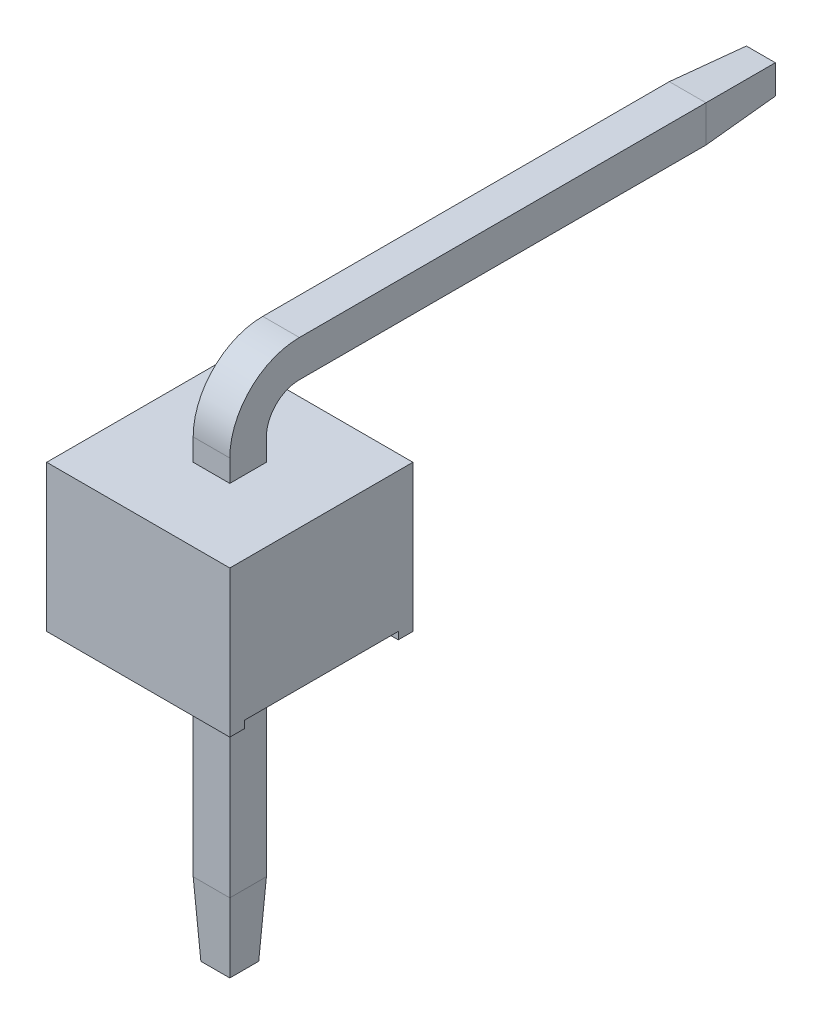
ISO-10303-21;
HEADER;
FILE_DESCRIPTION(('STEP AP214'),'2;1');
FILE_NAME('part.step','',(''),(''),'','','');
FILE_SCHEMA(('AUTOMOTIVE_DESIGN { 1 0 10303 214 1 1 1 1 }'));
ENDSEC;
DATA;
#1=APPLICATION_CONTEXT('core data for automotive mechanical design processes');
#2=APPLICATION_PROTOCOL_DEFINITION('international standard','automotive_design',2000,#1);
#3=PRODUCT_CONTEXT('',#1,'mechanical');
#4=PRODUCT('Part','Part','',(#3));
#5=PRODUCT_RELATED_PRODUCT_CATEGORY('part','',(#4));
#6=PRODUCT_DEFINITION_FORMATION('','',#4);
#7=PRODUCT_DEFINITION_CONTEXT('part definition',#1,'design');
#8=PRODUCT_DEFINITION('design','',#6,#7);
#9=PRODUCT_DEFINITION_SHAPE('','',#8);
#10=(LENGTH_UNIT() NAMED_UNIT(*) SI_UNIT(.MILLI.,.METRE.));
#11=(NAMED_UNIT(*) PLANE_ANGLE_UNIT() SI_UNIT($,.RADIAN.));
#12=(NAMED_UNIT(*) SI_UNIT($,.STERADIAN.) SOLID_ANGLE_UNIT());
#13=UNCERTAINTY_MEASURE_WITH_UNIT(LENGTH_MEASURE(1.E-05),#10,'distance_accuracy_value','');
#14=(GEOMETRIC_REPRESENTATION_CONTEXT(3) GLOBAL_UNCERTAINTY_ASSIGNED_CONTEXT((#13)) GLOBAL_UNIT_ASSIGNED_CONTEXT((#10,
#11,#12)) REPRESENTATION_CONTEXT('',''));
#15=CARTESIAN_POINT('',(0.,0.,0.));
#16=DIRECTION('',(0.,0.,1.));
#17=DIRECTION('',(1.,0.,0.));
#18=AXIS2_PLACEMENT_3D('',#15,#16,#17);
#19=CARTESIAN_POINT('',(0.,2.,0.));
#20=DIRECTION('',(0.,-1.,0.));
#21=DIRECTION('',(0.,0.,-1.));
#22=AXIS2_PLACEMENT_3D('',#19,#20,#21);
#23=PLANE('',#22);
#24=DIRECTION('',(0.,0.,-1.));
#25=VECTOR('',#24,1.);
#26=CARTESIAN_POINT('',(1.25,2.,1.25));
#27=LINE('',#26,#25);
#28=CARTESIAN_POINT('',(1.25,2.,1.25));
#29=VERTEX_POINT('',#28);
#30=CARTESIAN_POINT('',(1.25,2.,-1.25));
#31=VERTEX_POINT('',#30);
#32=EDGE_CURVE('E318',#29,#31,#27,.T.);
#33=ORIENTED_EDGE('',*,*,#32,.T.);
#34=DIRECTION('',(-1.,0.,0.));
#35=VECTOR('',#34,1.);
#36=CARTESIAN_POINT('',(-1.25,2.,-1.25));
#37=LINE('',#36,#35);
#38=CARTESIAN_POINT('',(-1.25,2.,-1.25));
#39=VERTEX_POINT('',#38);
#40=EDGE_CURVE('E321',#31,#39,#37,.T.);
#41=ORIENTED_EDGE('',*,*,#40,.T.);
#42=DIRECTION('',(0.,0.,1.));
#43=VECTOR('',#42,1.);
#44=CARTESIAN_POINT('',(-1.25,2.,1.25));
#45=LINE('',#44,#43);
#46=CARTESIAN_POINT('',(-1.25,2.,1.25));
#47=VERTEX_POINT('',#46);
#48=EDGE_CURVE('E324',#39,#47,#45,.T.);
#49=ORIENTED_EDGE('',*,*,#48,.T.);
#50=DIRECTION('',(1.,0.,0.));
#51=VECTOR('',#50,1.);
#52=CARTESIAN_POINT('',(-1.25,2.,1.25));
#53=LINE('',#52,#51);
#54=EDGE_CURVE('E326',#47,#29,#53,.T.);
#55=ORIENTED_EDGE('',*,*,#54,.T.);
#56=EDGE_LOOP('',(#33,#41,#49,#55));
#57=FACE_BOUND('',#56,.T.);
#58=DIRECTION('',(0.,0.,1.));
#59=VECTOR('',#58,1.);
#60=CARTESIAN_POINT('',(-0.25,2.,0.25));
#61=LINE('',#60,#59);
#62=CARTESIAN_POINT('',(-0.25,2.,-0.25));
#63=VERTEX_POINT('',#62);
#64=CARTESIAN_POINT('',(-0.25,2.,0.25));
#65=VERTEX_POINT('',#64);
#66=EDGE_CURVE('E204',#63,#65,#61,.T.);
#67=ORIENTED_EDGE('',*,*,#66,.F.);
#68=DIRECTION('',(-1.,0.,0.));
#69=VECTOR('',#68,1.);
#70=CARTESIAN_POINT('',(-0.25,2.,-0.25));
#71=LINE('',#70,#69);
#72=CARTESIAN_POINT('',(0.25,2.,-0.25));
#73=VERTEX_POINT('',#72);
#74=EDGE_CURVE('E704',#73,#63,#71,.T.);
#75=ORIENTED_EDGE('',*,*,#74,.F.);
#76=DIRECTION('',(0.,0.,-1.));
#77=VECTOR('',#76,1.);
#78=CARTESIAN_POINT('',(0.25,2.,-0.25));
#79=LINE('',#78,#77);
#80=CARTESIAN_POINT('',(0.25,2.,0.25));
#81=VERTEX_POINT('',#80);
#82=EDGE_CURVE('E713',#81,#73,#79,.T.);
#83=ORIENTED_EDGE('',*,*,#82,.F.);
#84=DIRECTION('',(1.,0.,0.));
#85=VECTOR('',#84,1.);
#86=CARTESIAN_POINT('',(0.25,2.,0.25));
#87=LINE('',#86,#85);
#88=EDGE_CURVE('E710',#65,#81,#87,.T.);
#89=ORIENTED_EDGE('',*,*,#88,.F.);
#90=EDGE_LOOP('',(#67,#75,#83,#89));
#91=FACE_BOUND('',#90,.T.);
#92=ADVANCED_FACE('F36',(#57,#91),#23,.F.);
#93=CARTESIAN_POINT('',(0.,0.1,0.));
#94=DIRECTION('',(0.,1.,0.));
#95=DIRECTION('',(0.,0.,1.));
#96=AXIS2_PLACEMENT_3D('',#93,#94,#95);
#97=PLANE('',#96);
#98=DIRECTION('',(0.,0.,1.));
#99=VECTOR('',#98,1.);
#100=CARTESIAN_POINT('',(1.25,0.1,-1.05));
#101=LINE('',#100,#99);
#102=CARTESIAN_POINT('',(1.25,0.1,-1.05));
#103=VERTEX_POINT('',#102);
#104=CARTESIAN_POINT('',(1.25,0.1,1.05));
#105=VERTEX_POINT('',#104);
#106=EDGE_CURVE('E293',#103,#105,#101,.T.);
#107=ORIENTED_EDGE('',*,*,#106,.T.);
#108=DIRECTION('',(-1.,0.,0.));
#109=VECTOR('',#108,1.);
#110=CARTESIAN_POINT('',(-1.25,0.1,1.05));
#111=LINE('',#110,#109);
#112=CARTESIAN_POINT('',(-1.25,0.1,1.05));
#113=VERTEX_POINT('',#112);
#114=EDGE_CURVE('E296',#105,#113,#111,.T.);
#115=ORIENTED_EDGE('',*,*,#114,.T.);
#116=DIRECTION('',(0.,0.,-1.));
#117=VECTOR('',#116,1.);
#118=CARTESIAN_POINT('',(-1.25,0.1,-1.05));
#119=LINE('',#118,#117);
#120=CARTESIAN_POINT('',(-1.25,0.1,-1.05));
#121=VERTEX_POINT('',#120);
#122=EDGE_CURVE('E300',#113,#121,#119,.T.);
#123=ORIENTED_EDGE('',*,*,#122,.T.);
#124=DIRECTION('',(1.,0.,0.));
#125=VECTOR('',#124,1.);
#126=CARTESIAN_POINT('',(-1.25,0.1,-1.05));
#127=LINE('',#126,#125);
#128=EDGE_CURVE('E302',#121,#103,#127,.T.);
#129=ORIENTED_EDGE('',*,*,#128,.T.);
#130=EDGE_LOOP('',(#107,#115,#123,#129));
#131=FACE_BOUND('',#130,.T.);
#132=DIRECTION('',(0.,0.,1.));
#133=VECTOR('',#132,1.);
#134=CARTESIAN_POINT('',(0.25,0.1,-0.25));
#135=LINE('',#134,#133);
#136=CARTESIAN_POINT('',(0.25,0.1,-0.25));
#137=VERTEX_POINT('',#136);
#138=CARTESIAN_POINT('',(0.25,0.1,0.25));
#139=VERTEX_POINT('',#138);
#140=EDGE_CURVE('E259',#137,#139,#135,.T.);
#141=ORIENTED_EDGE('',*,*,#140,.F.);
#142=DIRECTION('',(1.,0.,0.));
#143=VECTOR('',#142,1.);
#144=CARTESIAN_POINT('',(-0.25,0.1,-0.25));
#145=LINE('',#144,#143);
#146=CARTESIAN_POINT('',(-0.25,0.1,-0.25));
#147=VERTEX_POINT('',#146);
#148=EDGE_CURVE('E281',#147,#137,#145,.T.);
#149=ORIENTED_EDGE('',*,*,#148,.F.);
#150=DIRECTION('',(0.,0.,-1.));
#151=VECTOR('',#150,1.);
#152=CARTESIAN_POINT('',(-0.25,0.1,-0.25));
#153=LINE('',#152,#151);
#154=CARTESIAN_POINT('',(-0.25,0.1,0.25));
#155=VERTEX_POINT('',#154);
#156=EDGE_CURVE('E278',#155,#147,#153,.T.);
#157=ORIENTED_EDGE('',*,*,#156,.F.);
#158=DIRECTION('',(-1.,0.,0.));
#159=VECTOR('',#158,1.);
#160=CARTESIAN_POINT('',(-0.25,0.1,0.25));
#161=LINE('',#160,#159);
#162=EDGE_CURVE('E275',#139,#155,#161,.T.);
#163=ORIENTED_EDGE('',*,*,#162,.F.);
#164=EDGE_LOOP('',(#141,#149,#157,#163));
#165=FACE_BOUND('',#164,.T.);
#166=ADVANCED_FACE('F365',(#131,#165),#97,.F.);
#167=CARTESIAN_POINT('',(0.,0.,0.));
#168=DIRECTION('',(0.,-1.,0.));
#169=DIRECTION('',(0.,0.,-1.));
#170=AXIS2_PLACEMENT_3D('',#167,#168,#169);
#171=PLANE('',#170);
#172=DIRECTION('',(1.,0.,0.));
#173=VECTOR('',#172,1.);
#174=CARTESIAN_POINT('',(-1.25,0.,-1.05));
#175=LINE('',#174,#173);
#176=CARTESIAN_POINT('',(-1.25,0.,-1.05));
#177=VERTEX_POINT('',#176);
#178=CARTESIAN_POINT('',(1.25,0.,-1.05));
#179=VERTEX_POINT('',#178);
#180=EDGE_CURVE('E297',#177,#179,#175,.T.);
#181=ORIENTED_EDGE('',*,*,#180,.F.);
#182=DIRECTION('',(0.,0.,1.));
#183=VECTOR('',#182,1.);
#184=CARTESIAN_POINT('',(-1.25,0.,1.25));
#185=LINE('',#184,#183);
#186=CARTESIAN_POINT('',(-1.25,0.,-1.25));
#187=VERTEX_POINT('',#186);
#188=EDGE_CURVE('E335',#187,#177,#185,.T.);
#189=ORIENTED_EDGE('',*,*,#188,.F.);
#190=DIRECTION('',(-1.,0.,0.));
#191=VECTOR('',#190,1.);
#192=CARTESIAN_POINT('',(-1.25,0.,-1.25));
#193=LINE('',#192,#191);
#194=CARTESIAN_POINT('',(1.25,0.,-1.25));
#195=VERTEX_POINT('',#194);
#196=EDGE_CURVE('E332',#195,#187,#193,.T.);
#197=ORIENTED_EDGE('',*,*,#196,.F.);
#198=DIRECTION('',(0.,0.,-1.));
#199=VECTOR('',#198,1.);
#200=CARTESIAN_POINT('',(1.25,0.,1.25));
#201=LINE('',#200,#199);
#202=EDGE_CURVE('E311',#179,#195,#201,.T.);
#203=ORIENTED_EDGE('',*,*,#202,.F.);
#204=EDGE_LOOP('',(#181,#189,#197,#203));
#205=FACE_BOUND('',#204,.T.);
#206=ADVANCED_FACE('F355',(#205),#171,.T.);
#207=CARTESIAN_POINT('',(1.25,2.,1.25));
#208=DIRECTION('',(-1.,0.,0.));
#209=DIRECTION('',(0.,0.,1.));
#210=AXIS2_PLACEMENT_3D('',#207,#208,#209);
#211=PLANE('',#210);
#212=ORIENTED_EDGE('',*,*,#106,.F.);
#213=DIRECTION('',(0.,-1.,0.));
#214=VECTOR('',#213,1.);
#215=CARTESIAN_POINT('',(1.25,0.1,-1.05));
#216=LINE('',#215,#214);
#217=EDGE_CURVE('E308',#103,#179,#216,.T.);
#218=ORIENTED_EDGE('',*,*,#217,.T.);
#219=ORIENTED_EDGE('',*,*,#202,.T.);
#220=DIRECTION('',(0.,-1.,0.));
#221=VECTOR('',#220,1.);
#222=CARTESIAN_POINT('',(1.25,2.,-1.25));
#223=LINE('',#222,#221);
#224=EDGE_CURVE('E12',#31,#195,#223,.T.);
#225=ORIENTED_EDGE('',*,*,#224,.F.);
#226=ORIENTED_EDGE('',*,*,#32,.F.);
#227=DIRECTION('',(0.,-1.,0.));
#228=VECTOR('',#227,1.);
#229=CARTESIAN_POINT('',(1.25,2.,1.25));
#230=LINE('',#229,#228);
#231=CARTESIAN_POINT('',(1.25,0.,1.25));
#232=VERTEX_POINT('',#231);
#233=EDGE_CURVE('E328',#29,#232,#230,.T.);
#234=ORIENTED_EDGE('',*,*,#233,.T.);
#235=CARTESIAN_POINT('',(1.25,0.,1.05));
#236=VERTEX_POINT('',#235);
#237=EDGE_CURVE('E329',#232,#236,#201,.T.);
#238=ORIENTED_EDGE('',*,*,#237,.T.);
#239=DIRECTION('',(0.,-1.,0.));
#240=VECTOR('',#239,1.);
#241=CARTESIAN_POINT('',(1.25,0.1,1.05));
#242=LINE('',#241,#240);
#243=EDGE_CURVE('E305',#105,#236,#242,.T.);
#244=ORIENTED_EDGE('',*,*,#243,.F.);
#245=EDGE_LOOP('',(#212,#218,#219,#225,#226,#234,#238,#244));
#246=FACE_BOUND('',#245,.T.);
#247=ADVANCED_FACE('F38',(#246),#211,.F.);
#248=CARTESIAN_POINT('',(-1.25,2.,-1.25));
#249=DIRECTION('',(0.,0.,1.));
#250=DIRECTION('',(1.,0.,0.));
#251=AXIS2_PLACEMENT_3D('',#248,#249,#250);
#252=PLANE('',#251);
#253=ORIENTED_EDGE('',*,*,#196,.T.);
#254=DIRECTION('',(0.,-1.,0.));
#255=VECTOR('',#254,1.);
#256=CARTESIAN_POINT('',(-1.25,2.,-1.25));
#257=LINE('',#256,#255);
#258=EDGE_CURVE('E44',#39,#187,#257,.T.);
#259=ORIENTED_EDGE('',*,*,#258,.F.);
#260=ORIENTED_EDGE('',*,*,#40,.F.);
#261=ORIENTED_EDGE('',*,*,#224,.T.);
#262=EDGE_LOOP('',(#253,#259,#260,#261));
#263=FACE_BOUND('',#262,.T.);
#264=ADVANCED_FACE('F382',(#263),#252,.F.);
#265=CARTESIAN_POINT('',(-1.25,2.,1.25));
#266=DIRECTION('',(1.,0.,0.));
#267=DIRECTION('',(0.,0.,-1.));
#268=AXIS2_PLACEMENT_3D('',#265,#266,#267);
#269=PLANE('',#268);
#270=ORIENTED_EDGE('',*,*,#188,.T.);
#271=DIRECTION('',(0.,-1.,0.));
#272=VECTOR('',#271,1.);
#273=CARTESIAN_POINT('',(-1.25,0.1,-1.05));
#274=LINE('',#273,#272);
#275=EDGE_CURVE('E312',#121,#177,#274,.T.);
#276=ORIENTED_EDGE('',*,*,#275,.F.);
#277=ORIENTED_EDGE('',*,*,#122,.F.);
#278=DIRECTION('',(0.,-1.,0.));
#279=VECTOR('',#278,1.);
#280=CARTESIAN_POINT('',(-1.25,0.1,1.05));
#281=LINE('',#280,#279);
#282=CARTESIAN_POINT('',(-1.25,0.,1.05));
#283=VERTEX_POINT('',#282);
#284=EDGE_CURVE('E314',#113,#283,#281,.T.);
#285=ORIENTED_EDGE('',*,*,#284,.T.);
#286=CARTESIAN_POINT('',(-1.25,0.,1.25));
#287=VERTEX_POINT('',#286);
#288=EDGE_CURVE('E334',#283,#287,#185,.T.);
#289=ORIENTED_EDGE('',*,*,#288,.T.);
#290=DIRECTION('',(0.,-1.,0.));
#291=VECTOR('',#290,1.);
#292=CARTESIAN_POINT('',(-1.25,2.,1.25));
#293=LINE('',#292,#291);
#294=EDGE_CURVE('E341',#47,#287,#293,.T.);
#295=ORIENTED_EDGE('',*,*,#294,.F.);
#296=ORIENTED_EDGE('',*,*,#48,.F.);
#297=ORIENTED_EDGE('',*,*,#258,.T.);
#298=EDGE_LOOP('',(#270,#276,#277,#285,#289,#295,#296,#297));
#299=FACE_BOUND('',#298,.T.);
#300=ADVANCED_FACE('F348',(#299),#269,.F.);
#301=CARTESIAN_POINT('',(-1.25,2.,1.25));
#302=DIRECTION('',(0.,0.,-1.));
#303=DIRECTION('',(-1.,0.,0.));
#304=AXIS2_PLACEMENT_3D('',#301,#302,#303);
#305=PLANE('',#304);
#306=DIRECTION('',(1.,0.,0.));
#307=VECTOR('',#306,1.);
#308=CARTESIAN_POINT('',(-1.25,0.,1.25));
#309=LINE('',#308,#307);
#310=EDGE_CURVE('E322',#287,#232,#309,.T.);
#311=ORIENTED_EDGE('',*,*,#310,.T.);
#312=ORIENTED_EDGE('',*,*,#233,.F.);
#313=ORIENTED_EDGE('',*,*,#54,.F.);
#314=ORIENTED_EDGE('',*,*,#294,.T.);
#315=EDGE_LOOP('',(#311,#312,#313,#314));
#316=FACE_BOUND('',#315,.T.);
#317=ADVANCED_FACE('F377',(#316),#305,.F.);
#318=DIRECTION('',(-1.,0.,0.));
#319=VECTOR('',#318,1.);
#320=CARTESIAN_POINT('',(-1.25,0.,1.05));
#321=LINE('',#320,#319);
#322=EDGE_CURVE('E292',#236,#283,#321,.T.);
#323=ORIENTED_EDGE('',*,*,#322,.F.);
#324=ORIENTED_EDGE('',*,*,#237,.F.);
#325=ORIENTED_EDGE('',*,*,#310,.F.);
#326=ORIENTED_EDGE('',*,*,#288,.F.);
#327=EDGE_LOOP('',(#323,#324,#325,#326));
#328=FACE_BOUND('',#327,.T.);
#329=ADVANCED_FACE('F373',(#328),#171,.T.);
#330=CARTESIAN_POINT('',(-1.25,0.1,-1.05));
#331=DIRECTION('',(0.,0.,-1.));
#332=DIRECTION('',(-1.,0.,0.));
#333=AXIS2_PLACEMENT_3D('',#330,#331,#332);
#334=PLANE('',#333);
#335=ORIENTED_EDGE('',*,*,#180,.T.);
#336=ORIENTED_EDGE('',*,*,#217,.F.);
#337=ORIENTED_EDGE('',*,*,#128,.F.);
#338=ORIENTED_EDGE('',*,*,#275,.T.);
#339=EDGE_LOOP('',(#335,#336,#337,#338));
#340=FACE_BOUND('',#339,.T.);
#341=ADVANCED_FACE('F358',(#340),#334,.F.);
#342=CARTESIAN_POINT('',(-1.25,0.1,1.05));
#343=DIRECTION('',(0.,0.,1.));
#344=DIRECTION('',(1.,0.,0.));
#345=AXIS2_PLACEMENT_3D('',#342,#343,#344);
#346=PLANE('',#345);
#347=ORIENTED_EDGE('',*,*,#322,.T.);
#348=ORIENTED_EDGE('',*,*,#284,.F.);
#349=ORIENTED_EDGE('',*,*,#114,.F.);
#350=ORIENTED_EDGE('',*,*,#243,.T.);
#351=EDGE_LOOP('',(#347,#348,#349,#350));
#352=FACE_BOUND('',#351,.T.);
#353=ADVANCED_FACE('F397',(#352),#346,.F.);
#354=CARTESIAN_POINT('',(0.25,-3.9,-0.25));
#355=DIRECTION('',(-1.,0.,0.));
#356=DIRECTION('',(0.,0.,1.));
#357=AXIS2_PLACEMENT_3D('',#354,#355,#356);
#358=PLANE('',#357);
#359=DIRECTION('',(0.,1.,0.));
#360=VECTOR('',#359,1.);
#361=CARTESIAN_POINT('',(0.25,-3.9,0.25));
#362=LINE('',#361,#360);
#363=CARTESIAN_POINT('',(0.25,-2.9,0.25));
#364=VERTEX_POINT('',#363);
#365=EDGE_CURVE('E290',#364,#139,#362,.T.);
#366=ORIENTED_EDGE('',*,*,#365,.F.);
#367=DIRECTION('',(0.,0.,1.));
#368=VECTOR('',#367,1.);
#369=CARTESIAN_POINT('',(0.25,-2.9,-0.25));
#370=LINE('',#369,#368);
#371=CARTESIAN_POINT('',(0.25,-2.9,-0.25));
#372=VERTEX_POINT('',#371);
#373=EDGE_CURVE('E243',#372,#364,#370,.T.);
#374=ORIENTED_EDGE('',*,*,#373,.F.);
#375=DIRECTION('',(0.,1.,0.));
#376=VECTOR('',#375,1.);
#377=CARTESIAN_POINT('',(0.25,-3.9,-0.25));
#378=LINE('',#377,#376);
#379=EDGE_CURVE('E284',#372,#137,#378,.T.);
#380=ORIENTED_EDGE('',*,*,#379,.T.);
#381=ORIENTED_EDGE('',*,*,#140,.T.);
#382=EDGE_LOOP('',(#366,#374,#380,#381));
#383=FACE_BOUND('',#382,.T.);
#384=ADVANCED_FACE('F422',(#383),#358,.F.);
#385=CARTESIAN_POINT('',(-0.25,-3.9,0.25));
#386=DIRECTION('',(0.,0.,-1.));
#387=DIRECTION('',(-1.,0.,0.));
#388=AXIS2_PLACEMENT_3D('',#385,#386,#387);
#389=PLANE('',#388);
#390=DIRECTION('',(0.,1.,0.));
#391=VECTOR('',#390,1.);
#392=CARTESIAN_POINT('',(-0.25,-3.9,0.25));
#393=LINE('',#392,#391);
#394=CARTESIAN_POINT('',(-0.25,-2.9,0.25));
#395=VERTEX_POINT('',#394);
#396=EDGE_CURVE('E288',#395,#155,#393,.T.);
#397=ORIENTED_EDGE('',*,*,#396,.F.);
#398=DIRECTION('',(-1.,0.,0.));
#399=VECTOR('',#398,1.);
#400=CARTESIAN_POINT('',(0.25,-2.9,0.25));
#401=LINE('',#400,#399);
#402=EDGE_CURVE('E246',#364,#395,#401,.T.);
#403=ORIENTED_EDGE('',*,*,#402,.F.);
#404=ORIENTED_EDGE('',*,*,#365,.T.);
#405=ORIENTED_EDGE('',*,*,#162,.T.);
#406=EDGE_LOOP('',(#397,#403,#404,#405));
#407=FACE_BOUND('',#406,.T.);
#408=ADVANCED_FACE('F429',(#407),#389,.F.);
#409=CARTESIAN_POINT('',(-0.25,-3.9,-0.25));
#410=DIRECTION('',(1.,0.,0.));
#411=DIRECTION('',(0.,0.,-1.));
#412=AXIS2_PLACEMENT_3D('',#409,#410,#411);
#413=PLANE('',#412);
#414=DIRECTION('',(0.,1.,0.));
#415=VECTOR('',#414,1.);
#416=CARTESIAN_POINT('',(-0.25,-3.9,-0.25));
#417=LINE('',#416,#415);
#418=CARTESIAN_POINT('',(-0.25,-2.9,-0.25));
#419=VERTEX_POINT('',#418);
#420=EDGE_CURVE('E286',#419,#147,#417,.T.);
#421=ORIENTED_EDGE('',*,*,#420,.F.);
#422=DIRECTION('',(0.,0.,-1.));
#423=VECTOR('',#422,1.);
#424=CARTESIAN_POINT('',(-0.25,-2.9,0.25));
#425=LINE('',#424,#423);
#426=EDGE_CURVE('E249',#395,#419,#425,.T.);
#427=ORIENTED_EDGE('',*,*,#426,.F.);
#428=ORIENTED_EDGE('',*,*,#396,.T.);
#429=ORIENTED_EDGE('',*,*,#156,.T.);
#430=EDGE_LOOP('',(#421,#427,#428,#429));
#431=FACE_BOUND('',#430,.T.);
#432=ADVANCED_FACE('F437',(#431),#413,.F.);
#433=CARTESIAN_POINT('',(-0.25,-3.9,-0.25));
#434=DIRECTION('',(0.,0.,1.));
#435=DIRECTION('',(1.,0.,0.));
#436=AXIS2_PLACEMENT_3D('',#433,#434,#435);
#437=PLANE('',#436);
#438=ORIENTED_EDGE('',*,*,#379,.F.);
#439=DIRECTION('',(1.,0.,0.));
#440=VECTOR('',#439,1.);
#441=CARTESIAN_POINT('',(-0.25,-2.9,-0.25));
#442=LINE('',#441,#440);
#443=EDGE_CURVE('E240',#419,#372,#442,.T.);
#444=ORIENTED_EDGE('',*,*,#443,.F.);
#445=ORIENTED_EDGE('',*,*,#420,.T.);
#446=ORIENTED_EDGE('',*,*,#148,.T.);
#447=EDGE_LOOP('',(#438,#444,#445,#446));
#448=FACE_BOUND('',#447,.T.);
#449=ADVANCED_FACE('F445',(#448),#437,.F.);
#450=CARTESIAN_POINT('',(-0.25,-2.9,-0.25));
#451=DIRECTION('',(0.,0.0523359562429439,0.998629534754574));
#452=DIRECTION('',(0.,-0.998629534754574,0.0523359562429439));
#453=AXIS2_PLACEMENT_3D('',#450,#451,#452);
#454=PLANE('',#453);
#455=ORIENTED_EDGE('',*,*,#443,.T.);
#456=DIRECTION('',(0.052264427688714,0.997264688634237,-0.052264427688714));
#457=VECTOR('',#456,1.);
#458=CARTESIAN_POINT('',(0.25,-2.9,-0.25));
#459=LINE('',#458,#457);
#460=CARTESIAN_POINT('',(0.197592220716959,-3.9,-0.197592220716959));
#461=VERTEX_POINT('',#460);
#462=EDGE_CURVE('E257',#461,#372,#459,.T.);
#463=ORIENTED_EDGE('',*,*,#462,.F.);
#464=DIRECTION('',(1.,0.,0.));
#465=VECTOR('',#464,1.);
#466=CARTESIAN_POINT('',(-0.25,-3.9,-0.197592220716959));
#467=LINE('',#466,#465);
#468=CARTESIAN_POINT('',(-0.197592220716959,-3.9,-0.197592220716959));
#469=VERTEX_POINT('',#468);
#470=EDGE_CURVE('E251',#469,#461,#467,.T.);
#471=ORIENTED_EDGE('',*,*,#470,.F.);
#472=DIRECTION('',(-0.052264427688714,0.997264688634237,-0.052264427688714));
#473=VECTOR('',#472,1.);
#474=CARTESIAN_POINT('',(-0.25,-2.9,-0.25));
#475=LINE('',#474,#473);
#476=EDGE_CURVE('E252',#469,#419,#475,.T.);
#477=ORIENTED_EDGE('',*,*,#476,.T.);
#478=EDGE_LOOP('',(#455,#463,#471,#477));
#479=FACE_BOUND('',#478,.T.);
#480=ADVANCED_FACE('F453',(#479),#454,.F.);
#481=CARTESIAN_POINT('',(0.25,-2.9,-0.25));
#482=DIRECTION('',(-0.998629534754574,0.0523359562429439,0.));
#483=DIRECTION('',(-0.0523359562429439,-0.998629534754574,0.));
#484=AXIS2_PLACEMENT_3D('',#481,#482,#483);
#485=PLANE('',#484);
#486=ORIENTED_EDGE('',*,*,#373,.T.);
#487=DIRECTION('',(0.052264427688714,0.997264688634237,0.052264427688714));
#488=VECTOR('',#487,1.);
#489=CARTESIAN_POINT('',(0.25,-2.9,0.25));
#490=LINE('',#489,#488);
#491=CARTESIAN_POINT('',(0.197592220716959,-3.9,0.197592220716959));
#492=VERTEX_POINT('',#491);
#493=EDGE_CURVE('E260',#492,#364,#490,.T.);
#494=ORIENTED_EDGE('',*,*,#493,.F.);
#495=DIRECTION('',(0.,0.,1.));
#496=VECTOR('',#495,1.);
#497=CARTESIAN_POINT('',(0.197592220716959,-3.9,-0.25));
#498=LINE('',#497,#496);
#499=EDGE_CURVE('E265',#461,#492,#498,.T.);
#500=ORIENTED_EDGE('',*,*,#499,.F.);
#501=ORIENTED_EDGE('',*,*,#462,.T.);
#502=EDGE_LOOP('',(#486,#494,#500,#501));
#503=FACE_BOUND('',#502,.T.);
#504=ADVANCED_FACE('F461',(#503),#485,.F.);
#505=CARTESIAN_POINT('',(0.25,-2.9,0.25));
#506=DIRECTION('',(0.,0.0523359562429439,-0.998629534754574));
#507=DIRECTION('',(0.,0.998629534754574,0.0523359562429439));
#508=AXIS2_PLACEMENT_3D('',#505,#506,#507);
#509=PLANE('',#508);
#510=ORIENTED_EDGE('',*,*,#402,.T.);
#511=DIRECTION('',(-0.052264427688714,0.997264688634237,0.052264427688714));
#512=VECTOR('',#511,1.);
#513=CARTESIAN_POINT('',(-0.25,-2.9,0.25));
#514=LINE('',#513,#512);
#515=CARTESIAN_POINT('',(-0.197592220716959,-3.9,0.197592220716959));
#516=VERTEX_POINT('',#515);
#517=EDGE_CURVE('E255',#516,#395,#514,.T.);
#518=ORIENTED_EDGE('',*,*,#517,.F.);
#519=DIRECTION('',(-1.,0.,0.));
#520=VECTOR('',#519,1.);
#521=CARTESIAN_POINT('',(0.25,-3.9,0.197592220716959));
#522=LINE('',#521,#520);
#523=EDGE_CURVE('E268',#492,#516,#522,.T.);
#524=ORIENTED_EDGE('',*,*,#523,.F.);
#525=ORIENTED_EDGE('',*,*,#493,.T.);
#526=EDGE_LOOP('',(#510,#518,#524,#525));
#527=FACE_BOUND('',#526,.T.);
#528=ADVANCED_FACE('F469',(#527),#509,.F.);
#529=CARTESIAN_POINT('',(-0.25,-2.9,0.25));
#530=DIRECTION('',(0.998629534754574,0.0523359562429439,0.));
#531=DIRECTION('',(-0.0523359562429439,0.998629534754574,0.));
#532=AXIS2_PLACEMENT_3D('',#529,#530,#531);
#533=PLANE('',#532);
#534=ORIENTED_EDGE('',*,*,#426,.T.);
#535=ORIENTED_EDGE('',*,*,#476,.F.);
#536=DIRECTION('',(0.,0.,-1.));
#537=VECTOR('',#536,1.);
#538=CARTESIAN_POINT('',(-0.197592220716959,-3.9,0.25));
#539=LINE('',#538,#537);
#540=EDGE_CURVE('E256',#516,#469,#539,.T.);
#541=ORIENTED_EDGE('',*,*,#540,.F.);
#542=ORIENTED_EDGE('',*,*,#517,.T.);
#543=EDGE_LOOP('',(#534,#535,#541,#542));
#544=FACE_BOUND('',#543,.T.);
#545=ADVANCED_FACE('F477',(#544),#533,.F.);
#546=CARTESIAN_POINT('',(0.,-3.9,0.));
#547=DIRECTION('',(0.,1.,0.));
#548=DIRECTION('',(0.,0.,1.));
#549=AXIS2_PLACEMENT_3D('',#546,#547,#548);
#550=PLANE('',#549);
#551=ORIENTED_EDGE('',*,*,#540,.T.);
#552=ORIENTED_EDGE('',*,*,#470,.T.);
#553=ORIENTED_EDGE('',*,*,#499,.T.);
#554=ORIENTED_EDGE('',*,*,#523,.T.);
#555=EDGE_LOOP('',(#551,#552,#553,#554));
#556=FACE_BOUND('',#555,.T.);
#557=ADVANCED_FACE('F485',(#556),#550,.F.);
#558=CARTESIAN_POINT('',(0.25,3.25,-0.700000000000008));
#559=DIRECTION('',(0.,1.,0.));
#560=DIRECTION('',(0.,0.,1.));
#561=AXIS2_PLACEMENT_3D('',#558,#559,#560);
#562=PLANE('',#561);
#563=DIRECTION('',(1.,0.,0.));
#564=VECTOR('',#563,1.);
#565=CARTESIAN_POINT('',(-0.25,3.25000000000001,-6.25));
#566=LINE('',#565,#564);
#567=CARTESIAN_POINT('',(-0.25,3.25000000000001,-6.25));
#568=VERTEX_POINT('',#567);
#569=CARTESIAN_POINT('',(0.25,3.25,-6.25));
#570=VERTEX_POINT('',#569);
#571=EDGE_CURVE('E51',#568,#570,#566,.T.);
#572=ORIENTED_EDGE('',*,*,#571,.F.);
#573=DIRECTION('',(0.,0.,-1.));
#574=VECTOR('',#573,1.);
#575=CARTESIAN_POINT('',(-0.25,3.25,-0.700000000000008));
#576=LINE('',#575,#574);
#577=CARTESIAN_POINT('',(-0.25,3.25,-0.700000000000008));
#578=VERTEX_POINT('',#577);
#579=EDGE_CURVE('E222',#578,#568,#576,.T.);
#580=ORIENTED_EDGE('',*,*,#579,.F.);
#581=DIRECTION('',(1.,0.,0.));
#582=VECTOR('',#581,1.);
#583=CARTESIAN_POINT('',(0.25,3.25,-0.700000000000008));
#584=LINE('',#583,#582);
#585=CARTESIAN_POINT('',(0.25,3.25,-0.700000000000008));
#586=VERTEX_POINT('',#585);
#587=EDGE_CURVE('E730',#578,#586,#584,.T.);
#588=ORIENTED_EDGE('',*,*,#587,.T.);
#589=DIRECTION('',(0.,0.,-1.));
#590=VECTOR('',#589,1.);
#591=CARTESIAN_POINT('',(0.25,3.25,-0.700000000000008));
#592=LINE('',#591,#590);
#593=EDGE_CURVE('E231',#586,#570,#592,.T.);
#594=ORIENTED_EDGE('',*,*,#593,.T.);
#595=EDGE_LOOP('',(#572,#580,#588,#594));
#596=FACE_BOUND('',#595,.T.);
#597=ADVANCED_FACE('F493',(#596),#562,.T.);
#598=CARTESIAN_POINT('',(-0.25,2.75,-0.700000000000001));
#599=DIRECTION('',(0.,-1.,0.));
#600=DIRECTION('',(0.,0.,-1.));
#601=AXIS2_PLACEMENT_3D('',#598,#599,#600);
#602=PLANE('',#601);
#603=DIRECTION('',(-1.,0.,0.));
#604=VECTOR('',#603,1.);
#605=CARTESIAN_POINT('',(0.25,2.75000000000001,-6.25));
#606=LINE('',#605,#604);
#607=CARTESIAN_POINT('',(0.25,2.75,-6.25));
#608=VERTEX_POINT('',#607);
#609=CARTESIAN_POINT('',(-0.25,2.75000000000001,-6.25));
#610=VERTEX_POINT('',#609);
#611=EDGE_CURVE('E208',#608,#610,#606,.T.);
#612=ORIENTED_EDGE('',*,*,#611,.F.);
#613=DIRECTION('',(0.,0.,-1.));
#614=VECTOR('',#613,1.);
#615=CARTESIAN_POINT('',(0.25,2.75,-0.700000000000001));
#616=LINE('',#615,#614);
#617=CARTESIAN_POINT('',(0.25,2.75,-0.700000000000001));
#618=VERTEX_POINT('',#617);
#619=EDGE_CURVE('E228',#618,#608,#616,.T.);
#620=ORIENTED_EDGE('',*,*,#619,.F.);
#621=DIRECTION('',(-1.,0.,0.));
#622=VECTOR('',#621,1.);
#623=CARTESIAN_POINT('',(-0.25,2.75,-0.700000000000001));
#624=LINE('',#623,#622);
#625=CARTESIAN_POINT('',(-0.25,2.75,-0.700000000000001));
#626=VERTEX_POINT('',#625);
#627=EDGE_CURVE('E226',#618,#626,#624,.T.);
#628=ORIENTED_EDGE('',*,*,#627,.T.);
#629=DIRECTION('',(0.,0.,-1.));
#630=VECTOR('',#629,1.);
#631=CARTESIAN_POINT('',(-0.25,2.75,-0.700000000000001));
#632=LINE('',#631,#630);
#633=EDGE_CURVE('E219',#626,#610,#632,.T.);
#634=ORIENTED_EDGE('',*,*,#633,.T.);
#635=EDGE_LOOP('',(#612,#620,#628,#634));
#636=FACE_BOUND('',#635,.T.);
#637=ADVANCED_FACE('F224',(#636),#602,.T.);
#638=CARTESIAN_POINT('',(0.,2.3,-0.7));
#639=DIRECTION('',(-1.,0.,0.));
#640=DIRECTION('',(0.,0.,1.));
#641=AXIS2_PLACEMENT_3D('',#638,#639,#640);
#642=CYLINDRICAL_SURFACE('',#641,0.95);
#643=DIRECTION('',(1.,0.,0.));
#644=VECTOR('',#643,1.);
#645=CARTESIAN_POINT('',(0.25,2.3,0.25));
#646=LINE('',#645,#644);
#647=CARTESIAN_POINT('',(-0.25,2.3,0.25));
#648=VERTEX_POINT('',#647);
#649=CARTESIAN_POINT('',(0.25,2.3,0.25));
#650=VERTEX_POINT('',#649);
#651=EDGE_CURVE('E700',#648,#650,#646,.T.);
#652=ORIENTED_EDGE('',*,*,#651,.T.);
#653=CARTESIAN_POINT('',(0.25,2.3,-0.7));
#654=DIRECTION('',(-1.,0.,0.));
#655=DIRECTION('',(0.,0.,1.));
#656=AXIS2_PLACEMENT_3D('',#653,#654,#655);
#657=CIRCLE('',#656,0.95);
#658=EDGE_CURVE('E233',#650,#586,#657,.T.);
#659=ORIENTED_EDGE('',*,*,#658,.T.);
#660=ORIENTED_EDGE('',*,*,#587,.F.);
#661=CARTESIAN_POINT('',(-0.25,2.3,-0.7));
#662=DIRECTION('',(-1.,0.,0.));
#663=DIRECTION('',(0.,0.,1.));
#664=AXIS2_PLACEMENT_3D('',#661,#662,#663);
#665=CIRCLE('',#664,0.95);
#666=EDGE_CURVE('E229',#648,#578,#665,.T.);
#667=ORIENTED_EDGE('',*,*,#666,.F.);
#668=EDGE_LOOP('',(#652,#659,#660,#667));
#669=FACE_BOUND('',#668,.T.);
#670=ADVANCED_FACE('F509',(#669),#642,.T.);
#671=CARTESIAN_POINT('',(0.,2.3,-0.7));
#672=DIRECTION('',(-1.,0.,0.));
#673=DIRECTION('',(0.,0.,1.));
#674=AXIS2_PLACEMENT_3D('',#671,#672,#673);
#675=CYLINDRICAL_SURFACE('',#674,0.45);
#676=DIRECTION('',(-1.,0.,0.));
#677=VECTOR('',#676,1.);
#678=CARTESIAN_POINT('',(-0.25,2.3,-0.25));
#679=LINE('',#678,#677);
#680=CARTESIAN_POINT('',(0.25,2.3,-0.25));
#681=VERTEX_POINT('',#680);
#682=CARTESIAN_POINT('',(-0.25,2.3,-0.25));
#683=VERTEX_POINT('',#682);
#684=EDGE_CURVE('E703',#681,#683,#679,.T.);
#685=ORIENTED_EDGE('',*,*,#684,.T.);
#686=CARTESIAN_POINT('',(-0.25,2.3,-0.7));
#687=DIRECTION('',(-1.,0.,0.));
#688=DIRECTION('',(0.,0.,1.));
#689=AXIS2_PLACEMENT_3D('',#686,#687,#688);
#690=CIRCLE('',#689,0.45);
#691=EDGE_CURVE('E733',#683,#626,#690,.T.);
#692=ORIENTED_EDGE('',*,*,#691,.T.);
#693=ORIENTED_EDGE('',*,*,#627,.F.);
#694=CARTESIAN_POINT('',(0.25,2.3,-0.7));
#695=DIRECTION('',(-1.,0.,0.));
#696=DIRECTION('',(0.,0.,1.));
#697=AXIS2_PLACEMENT_3D('',#694,#695,#696);
#698=CIRCLE('',#697,0.45);
#699=EDGE_CURVE('E735',#681,#618,#698,.T.);
#700=ORIENTED_EDGE('',*,*,#699,.F.);
#701=EDGE_LOOP('',(#685,#692,#693,#700));
#702=FACE_BOUND('',#701,.T.);
#703=ADVANCED_FACE('F517',(#702),#675,.F.);
#704=CARTESIAN_POINT('',(-0.25,2.3,0.25));
#705=DIRECTION('',(1.,0.,0.));
#706=DIRECTION('',(0.,0.,-1.));
#707=AXIS2_PLACEMENT_3D('',#704,#705,#706);
#708=PLANE('',#707);
#709=ORIENTED_EDGE('',*,*,#579,.T.);
#710=DIRECTION('',(0.,1.,0.));
#711=VECTOR('',#710,1.);
#712=CARTESIAN_POINT('',(-0.25,2.75000000000001,-6.25));
#713=LINE('',#712,#711);
#714=EDGE_CURVE('E201',#610,#568,#713,.T.);
#715=ORIENTED_EDGE('',*,*,#714,.F.);
#716=ORIENTED_EDGE('',*,*,#633,.F.);
#717=ORIENTED_EDGE('',*,*,#691,.F.);
#718=DIRECTION('',(0.,-1.,0.));
#719=VECTOR('',#718,1.);
#720=CARTESIAN_POINT('',(-0.25,2.3,-0.25));
#721=LINE('',#720,#719);
#722=EDGE_CURVE('E707',#683,#63,#721,.T.);
#723=ORIENTED_EDGE('',*,*,#722,.T.);
#724=ORIENTED_EDGE('',*,*,#66,.T.);
#725=DIRECTION('',(0.,-1.,0.));
#726=VECTOR('',#725,1.);
#727=CARTESIAN_POINT('',(-0.25,2.3,0.25));
#728=LINE('',#727,#726);
#729=EDGE_CURVE('E726',#648,#65,#728,.T.);
#730=ORIENTED_EDGE('',*,*,#729,.F.);
#731=ORIENTED_EDGE('',*,*,#666,.T.);
#732=EDGE_LOOP('',(#709,#715,#716,#717,#723,#724,#730,#731));
#733=FACE_BOUND('',#732,.T.);
#734=ADVANCED_FACE('F218',(#733),#708,.F.);
#735=CARTESIAN_POINT('',(0.25,2.3,0.25));
#736=DIRECTION('',(0.,0.,-1.));
#737=DIRECTION('',(-1.,0.,0.));
#738=AXIS2_PLACEMENT_3D('',#735,#736,#737);
#739=PLANE('',#738);
#740=ORIENTED_EDGE('',*,*,#88,.T.);
#741=DIRECTION('',(0.,-1.,0.));
#742=VECTOR('',#741,1.);
#743=CARTESIAN_POINT('',(0.25,2.3,0.25));
#744=LINE('',#743,#742);
#745=EDGE_CURVE('E723',#650,#81,#744,.T.);
#746=ORIENTED_EDGE('',*,*,#745,.F.);
#747=ORIENTED_EDGE('',*,*,#651,.F.);
#748=ORIENTED_EDGE('',*,*,#729,.T.);
#749=EDGE_LOOP('',(#740,#746,#747,#748));
#750=FACE_BOUND('',#749,.T.);
#751=ADVANCED_FACE('F532',(#750),#739,.F.);
#752=CARTESIAN_POINT('',(0.25,2.3,-0.25));
#753=DIRECTION('',(-1.,0.,0.));
#754=DIRECTION('',(0.,0.,1.));
#755=AXIS2_PLACEMENT_3D('',#752,#753,#754);
#756=PLANE('',#755);
#757=ORIENTED_EDGE('',*,*,#619,.T.);
#758=DIRECTION('',(0.,-1.,0.));
#759=VECTOR('',#758,1.);
#760=CARTESIAN_POINT('',(0.25,3.25000000000001,-6.25));
#761=LINE('',#760,#759);
#762=EDGE_CURVE('E742',#570,#608,#761,.T.);
#763=ORIENTED_EDGE('',*,*,#762,.F.);
#764=ORIENTED_EDGE('',*,*,#593,.F.);
#765=ORIENTED_EDGE('',*,*,#658,.F.);
#766=ORIENTED_EDGE('',*,*,#745,.T.);
#767=ORIENTED_EDGE('',*,*,#82,.T.);
#768=DIRECTION('',(0.,-1.,0.));
#769=VECTOR('',#768,1.);
#770=CARTESIAN_POINT('',(0.25,2.3,-0.25));
#771=LINE('',#770,#769);
#772=EDGE_CURVE('E720',#681,#73,#771,.T.);
#773=ORIENTED_EDGE('',*,*,#772,.F.);
#774=ORIENTED_EDGE('',*,*,#699,.T.);
#775=EDGE_LOOP('',(#757,#763,#764,#765,#766,#767,#773,#774));
#776=FACE_BOUND('',#775,.T.);
#777=ADVANCED_FACE('F539',(#776),#756,.F.);
#778=CARTESIAN_POINT('',(-0.25,2.3,-0.25));
#779=DIRECTION('',(0.,0.,1.));
#780=DIRECTION('',(1.,0.,0.));
#781=AXIS2_PLACEMENT_3D('',#778,#779,#780);
#782=PLANE('',#781);
#783=ORIENTED_EDGE('',*,*,#74,.T.);
#784=ORIENTED_EDGE('',*,*,#722,.F.);
#785=ORIENTED_EDGE('',*,*,#684,.F.);
#786=ORIENTED_EDGE('',*,*,#772,.T.);
#787=EDGE_LOOP('',(#783,#784,#785,#786));
#788=FACE_BOUND('',#787,.T.);
#789=ADVANCED_FACE('F546',(#788),#782,.F.);
#790=CARTESIAN_POINT('',(0.25,2.75000000000001,-6.25));
#791=DIRECTION('',(0.,0.998629534754574,0.0523359562429302));
#792=DIRECTION('',(0.,-0.0523359562429302,0.998629534754575));
#793=AXIS2_PLACEMENT_3D('',#790,#791,#792);
#794=PLANE('',#793);
#795=ORIENTED_EDGE('',*,*,#611,.T.);
#796=DIRECTION('',(-0.052264427688714,-0.0522644276887003,0.997264688634238));
#797=VECTOR('',#796,1.);
#798=CARTESIAN_POINT('',(-0.25,2.75000000000001,-6.25));
#799=LINE('',#798,#797);
#800=CARTESIAN_POINT('',(-0.197592220716959,2.80240777928304,-7.25));
#801=VERTEX_POINT('',#800);
#802=EDGE_CURVE('E197',#801,#610,#799,.T.);
#803=ORIENTED_EDGE('',*,*,#802,.F.);
#804=DIRECTION('',(-1.,0.,0.));
#805=VECTOR('',#804,1.);
#806=CARTESIAN_POINT('',(0.25,2.80240777928304,-7.25));
#807=LINE('',#806,#805);
#808=CARTESIAN_POINT('',(0.197592220716959,2.80240777928304,-7.25));
#809=VERTEX_POINT('',#808);
#810=EDGE_CURVE('E59',#809,#801,#807,.T.);
#811=ORIENTED_EDGE('',*,*,#810,.F.);
#812=DIRECTION('',(0.052264427688714,-0.0522644276887003,0.997264688634238));
#813=VECTOR('',#812,1.);
#814=CARTESIAN_POINT('',(0.25,2.75000000000001,-6.25));
#815=LINE('',#814,#813);
#816=EDGE_CURVE('E210',#809,#608,#815,.T.);
#817=ORIENTED_EDGE('',*,*,#816,.T.);
#818=EDGE_LOOP('',(#795,#803,#811,#817));
#819=FACE_BOUND('',#818,.T.);
#820=ADVANCED_FACE('F209',(#819),#794,.F.);
#821=CARTESIAN_POINT('',(-0.25,2.75000000000001,-6.25));
#822=DIRECTION('',(0.998629534754574,0.,0.0523359562429439));
#823=DIRECTION('',(0.0523359562429439,0.,-0.998629534754574));
#824=AXIS2_PLACEMENT_3D('',#821,#822,#823);
#825=PLANE('',#824);
#826=ORIENTED_EDGE('',*,*,#714,.T.);
#827=DIRECTION('',(-0.052264427688714,0.0522644276887276,0.997264688634237));
#828=VECTOR('',#827,1.);
#829=CARTESIAN_POINT('',(-0.25,3.25000000000001,-6.25));
#830=LINE('',#829,#828);
#831=CARTESIAN_POINT('',(-0.197592220716959,3.19759222071696,-7.25));
#832=VERTEX_POINT('',#831);
#833=EDGE_CURVE('E205',#832,#568,#830,.T.);
#834=ORIENTED_EDGE('',*,*,#833,.F.);
#835=DIRECTION('',(0.,1.,0.));
#836=VECTOR('',#835,1.);
#837=CARTESIAN_POINT('',(-0.197592220716959,2.75,-7.25));
#838=LINE('',#837,#836);
#839=EDGE_CURVE('E203',#801,#832,#838,.T.);
#840=ORIENTED_EDGE('',*,*,#839,.F.);
#841=ORIENTED_EDGE('',*,*,#802,.T.);
#842=EDGE_LOOP('',(#826,#834,#840,#841));
#843=FACE_BOUND('',#842,.T.);
#844=ADVANCED_FACE('F199',(#843),#825,.F.);
#845=CARTESIAN_POINT('',(-0.25,3.25000000000001,-6.25));
#846=DIRECTION('',(0.,-0.998629534754573,0.0523359562429576));
#847=DIRECTION('',(0.,-0.0523359562429576,-0.998629534754573));
#848=AXIS2_PLACEMENT_3D('',#845,#846,#847);
#849=PLANE('',#848);
#850=ORIENTED_EDGE('',*,*,#571,.T.);
#851=DIRECTION('',(0.052264427688714,0.0522644276887276,0.997264688634237));
#852=VECTOR('',#851,1.);
#853=CARTESIAN_POINT('',(0.25,3.25000000000001,-6.25));
#854=LINE('',#853,#852);
#855=CARTESIAN_POINT('',(0.197592220716959,3.19759222071696,-7.25));
#856=VERTEX_POINT('',#855);
#857=EDGE_CURVE('E693',#856,#570,#854,.T.);
#858=ORIENTED_EDGE('',*,*,#857,.F.);
#859=DIRECTION('',(1.,0.,0.));
#860=VECTOR('',#859,1.);
#861=CARTESIAN_POINT('',(-0.25,3.19759222071696,-7.25));
#862=LINE('',#861,#860);
#863=EDGE_CURVE('E691',#832,#856,#862,.T.);
#864=ORIENTED_EDGE('',*,*,#863,.F.);
#865=ORIENTED_EDGE('',*,*,#833,.T.);
#866=EDGE_LOOP('',(#850,#858,#864,#865));
#867=FACE_BOUND('',#866,.T.);
#868=ADVANCED_FACE('F566',(#867),#849,.F.);
#869=CARTESIAN_POINT('',(0.25,3.25000000000001,-6.25));
#870=DIRECTION('',(-0.998629534754574,0.,0.0523359562429439));
#871=DIRECTION('',(0.0523359562429439,0.,0.998629534754574));
#872=AXIS2_PLACEMENT_3D('',#869,#870,#871);
#873=PLANE('',#872);
#874=ORIENTED_EDGE('',*,*,#762,.T.);
#875=ORIENTED_EDGE('',*,*,#816,.F.);
#876=DIRECTION('',(0.,-1.,0.));
#877=VECTOR('',#876,1.);
#878=CARTESIAN_POINT('',(0.197592220716959,3.25,-7.25));
#879=LINE('',#878,#877);
#880=EDGE_CURVE('E689',#856,#809,#879,.T.);
#881=ORIENTED_EDGE('',*,*,#880,.F.);
#882=ORIENTED_EDGE('',*,*,#857,.T.);
#883=EDGE_LOOP('',(#874,#875,#881,#882));
#884=FACE_BOUND('',#883,.T.);
#885=ADVANCED_FACE('F573',(#884),#873,.F.);
#886=CARTESIAN_POINT('',(0.,3.,-7.25));
#887=DIRECTION('',(0.,0.,1.));
#888=DIRECTION('',(0.,-1.,0.));
#889=AXIS2_PLACEMENT_3D('',#886,#887,#888);
#890=PLANE('',#889);
#891=ORIENTED_EDGE('',*,*,#880,.T.);
#892=ORIENTED_EDGE('',*,*,#810,.T.);
#893=ORIENTED_EDGE('',*,*,#839,.T.);
#894=ORIENTED_EDGE('',*,*,#863,.T.);
#895=EDGE_LOOP('',(#891,#892,#893,#894));
#896=FACE_BOUND('',#895,.T.);
#897=ADVANCED_FACE('F580',(#896),#890,.F.);
#898=CLOSED_SHELL('',(#92,#166,#206,#247,#264,#300,#317,#329,#341,#353,#384,#408,#432,#449,#480,
#504,#528,#545,#557,#597,#637,#670,#703,#734,#751,#777,#789,#820,#844,#868,#885,#897));
#899=MANIFOLD_SOLID_BREP('B2',#898);
#900=ADVANCED_BREP_SHAPE_REPRESENTATION('',(#18,#899),#14);
#901=SHAPE_DEFINITION_REPRESENTATION(#9,#900);
ENDSEC;
END-ISO-10303-21;
